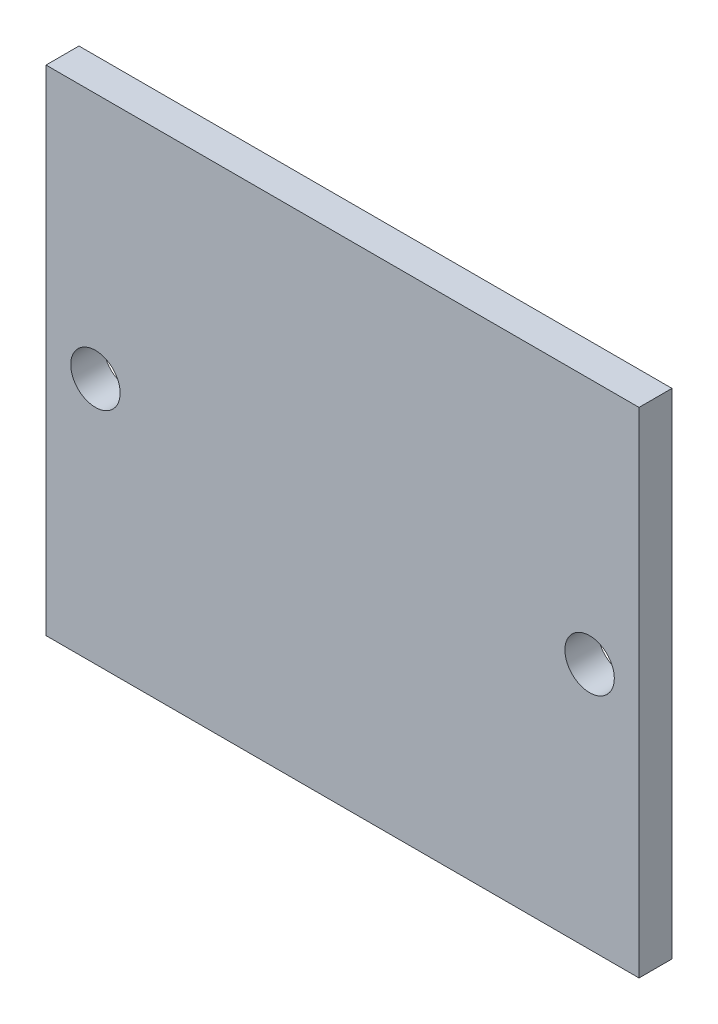
ISO-10303-21;
HEADER;
FILE_DESCRIPTION(('STEP AP214'),'2;1');
FILE_NAME('part.step','',(''),(''),'','','');
FILE_SCHEMA(('AUTOMOTIVE_DESIGN { 1 0 10303 214 1 1 1 1 }'));
ENDSEC;
DATA;
#1=APPLICATION_CONTEXT('core data for automotive mechanical design processes');
#2=APPLICATION_PROTOCOL_DEFINITION('international standard','automotive_design',2000,#1);
#3=PRODUCT_CONTEXT('',#1,'mechanical');
#4=PRODUCT('Part','Part','',(#3));
#5=PRODUCT_RELATED_PRODUCT_CATEGORY('part','',(#4));
#6=PRODUCT_DEFINITION_FORMATION('','',#4);
#7=PRODUCT_DEFINITION_CONTEXT('part definition',#1,'design');
#8=PRODUCT_DEFINITION('design','',#6,#7);
#9=PRODUCT_DEFINITION_SHAPE('','',#8);
#10=(LENGTH_UNIT() NAMED_UNIT(*) SI_UNIT(.MILLI.,.METRE.));
#11=(NAMED_UNIT(*) PLANE_ANGLE_UNIT() SI_UNIT($,.RADIAN.));
#12=(NAMED_UNIT(*) SI_UNIT($,.STERADIAN.) SOLID_ANGLE_UNIT());
#13=UNCERTAINTY_MEASURE_WITH_UNIT(LENGTH_MEASURE(1.E-05),#10,'distance_accuracy_value','');
#14=(GEOMETRIC_REPRESENTATION_CONTEXT(3) GLOBAL_UNCERTAINTY_ASSIGNED_CONTEXT((#13)) GLOBAL_UNIT_ASSIGNED_CONTEXT((#10,
#11,#12)) REPRESENTATION_CONTEXT('',''));
#15=CARTESIAN_POINT('',(0.,0.,0.));
#16=DIRECTION('',(0.,0.,1.));
#17=DIRECTION('',(1.,0.,0.));
#18=AXIS2_PLACEMENT_3D('',#15,#16,#17);
#19=CARTESIAN_POINT('',(0.,0.,2.));
#20=DIRECTION('',(0.,0.,-1.));
#21=DIRECTION('',(-1.,0.,0.));
#22=AXIS2_PLACEMENT_3D('',#19,#20,#21);
#23=PLANE('',#22);
#24=DIRECTION('',(0.,1.,0.));
#25=VECTOR('',#24,1.);
#26=CARTESIAN_POINT('',(18.,-15.,2.));
#27=LINE('',#26,#25);
#28=CARTESIAN_POINT('',(18.,-15.,2.));
#29=VERTEX_POINT('',#28);
#30=CARTESIAN_POINT('',(18.,15.,2.));
#31=VERTEX_POINT('',#30);
#32=EDGE_CURVE('E85',#29,#31,#27,.T.);
#33=ORIENTED_EDGE('',*,*,#32,.T.);
#34=DIRECTION('',(-1.,0.,0.));
#35=VECTOR('',#34,1.);
#36=CARTESIAN_POINT('',(-18.,15.,2.));
#37=LINE('',#36,#35);
#38=CARTESIAN_POINT('',(-18.,15.,2.));
#39=VERTEX_POINT('',#38);
#40=EDGE_CURVE('E80',#31,#39,#37,.T.);
#41=ORIENTED_EDGE('',*,*,#40,.T.);
#42=DIRECTION('',(0.,-1.,0.));
#43=VECTOR('',#42,1.);
#44=CARTESIAN_POINT('',(-18.,-15.,2.));
#45=LINE('',#44,#43);
#46=CARTESIAN_POINT('',(-18.,-15.,2.));
#47=VERTEX_POINT('',#46);
#48=EDGE_CURVE('E83',#39,#47,#45,.T.);
#49=ORIENTED_EDGE('',*,*,#48,.T.);
#50=DIRECTION('',(1.,0.,0.));
#51=VECTOR('',#50,1.);
#52=CARTESIAN_POINT('',(-18.,-15.,2.));
#53=LINE('',#52,#51);
#54=EDGE_CURVE('E50',#47,#29,#53,.T.);
#55=ORIENTED_EDGE('',*,*,#54,.T.);
#56=EDGE_LOOP('',(#33,#41,#49,#55));
#57=FACE_BOUND('',#56,.T.);
#58=CARTESIAN_POINT('',(-15.,0.,2.));
#59=DIRECTION('',(0.,0.,1.));
#60=DIRECTION('',(1.,0.,0.));
#61=AXIS2_PLACEMENT_3D('',#58,#59,#60);
#62=CIRCLE('',#61,1.5);
#63=CARTESIAN_POINT('',(-13.5,0.,2.));
#64=VERTEX_POINT('',#63);
#65=EDGE_CURVE('E100',#64,#64,#62,.T.);
#66=ORIENTED_EDGE('',*,*,#65,.F.);
#67=EDGE_LOOP('',(#66));
#68=FACE_BOUND('',#67,.T.);
#69=CARTESIAN_POINT('',(15.,0.,2.));
#70=DIRECTION('',(0.,0.,1.));
#71=DIRECTION('',(1.,0.,0.));
#72=AXIS2_PLACEMENT_3D('',#69,#70,#71);
#73=CIRCLE('',#72,1.5);
#74=CARTESIAN_POINT('',(16.5,0.,2.));
#75=VERTEX_POINT('',#74);
#76=EDGE_CURVE('E115',#75,#75,#73,.T.);
#77=ORIENTED_EDGE('',*,*,#76,.F.);
#78=EDGE_LOOP('',(#77));
#79=FACE_BOUND('',#78,.T.);
#80=ADVANCED_FACE('F33',(#57,#68,#79),#23,.F.);
#81=CARTESIAN_POINT('',(0.,0.,0.));
#82=DIRECTION('',(0.,0.,-1.));
#83=DIRECTION('',(-1.,0.,0.));
#84=AXIS2_PLACEMENT_3D('',#81,#82,#83);
#85=PLANE('',#84);
#86=CARTESIAN_POINT('',(-15.,0.,0.));
#87=DIRECTION('',(0.,0.,1.));
#88=DIRECTION('',(1.,0.,0.));
#89=AXIS2_PLACEMENT_3D('',#86,#87,#88);
#90=CIRCLE('',#89,1.5);
#91=CARTESIAN_POINT('',(-13.5,0.,0.));
#92=VERTEX_POINT('',#91);
#93=EDGE_CURVE('E112',#92,#92,#90,.T.);
#94=ORIENTED_EDGE('',*,*,#93,.T.);
#95=EDGE_LOOP('',(#94));
#96=FACE_BOUND('',#95,.T.);
#97=DIRECTION('',(0.,1.,0.));
#98=VECTOR('',#97,1.);
#99=CARTESIAN_POINT('',(18.,-15.,0.));
#100=LINE('',#99,#98);
#101=CARTESIAN_POINT('',(18.,-15.,0.));
#102=VERTEX_POINT('',#101);
#103=CARTESIAN_POINT('',(18.,15.,0.));
#104=VERTEX_POINT('',#103);
#105=EDGE_CURVE('E97',#102,#104,#100,.T.);
#106=ORIENTED_EDGE('',*,*,#105,.F.);
#107=DIRECTION('',(1.,0.,0.));
#108=VECTOR('',#107,1.);
#109=CARTESIAN_POINT('',(-18.,-15.,0.));
#110=LINE('',#109,#108);
#111=CARTESIAN_POINT('',(-18.,-15.,0.));
#112=VERTEX_POINT('',#111);
#113=EDGE_CURVE('E73',#112,#102,#110,.T.);
#114=ORIENTED_EDGE('',*,*,#113,.F.);
#115=DIRECTION('',(0.,-1.,0.));
#116=VECTOR('',#115,1.);
#117=CARTESIAN_POINT('',(-18.,-15.,0.));
#118=LINE('',#117,#116);
#119=CARTESIAN_POINT('',(-18.,15.,0.));
#120=VERTEX_POINT('',#119);
#121=EDGE_CURVE('E67',#120,#112,#118,.T.);
#122=ORIENTED_EDGE('',*,*,#121,.F.);
#123=DIRECTION('',(-1.,0.,0.));
#124=VECTOR('',#123,1.);
#125=CARTESIAN_POINT('',(-18.,15.,0.));
#126=LINE('',#125,#124);
#127=EDGE_CURVE('E89',#104,#120,#126,.T.);
#128=ORIENTED_EDGE('',*,*,#127,.F.);
#129=EDGE_LOOP('',(#106,#114,#122,#128));
#130=FACE_BOUND('',#129,.T.);
#131=CARTESIAN_POINT('',(15.,0.,0.));
#132=DIRECTION('',(0.,0.,1.));
#133=DIRECTION('',(1.,0.,0.));
#134=AXIS2_PLACEMENT_3D('',#131,#132,#133);
#135=CIRCLE('',#134,1.5);
#136=CARTESIAN_POINT('',(16.5,0.,0.));
#137=VERTEX_POINT('',#136);
#138=EDGE_CURVE('E118',#137,#137,#135,.T.);
#139=ORIENTED_EDGE('',*,*,#138,.T.);
#140=EDGE_LOOP('',(#139));
#141=FACE_BOUND('',#140,.T.);
#142=ADVANCED_FACE('F108',(#96,#130,#141),#85,.T.);
#143=CARTESIAN_POINT('',(18.,-15.,2.));
#144=DIRECTION('',(-1.,0.,0.));
#145=DIRECTION('',(0.,0.,1.));
#146=AXIS2_PLACEMENT_3D('',#143,#144,#145);
#147=PLANE('',#146);
#148=ORIENTED_EDGE('',*,*,#105,.T.);
#149=DIRECTION('',(0.,0.,-1.));
#150=VECTOR('',#149,1.);
#151=CARTESIAN_POINT('',(18.,15.,2.));
#152=LINE('',#151,#150);
#153=EDGE_CURVE('E11',#31,#104,#152,.T.);
#154=ORIENTED_EDGE('',*,*,#153,.F.);
#155=ORIENTED_EDGE('',*,*,#32,.F.);
#156=DIRECTION('',(0.,0.,-1.));
#157=VECTOR('',#156,1.);
#158=CARTESIAN_POINT('',(18.,-15.,2.));
#159=LINE('',#158,#157);
#160=EDGE_CURVE('E93',#29,#102,#159,.T.);
#161=ORIENTED_EDGE('',*,*,#160,.T.);
#162=EDGE_LOOP('',(#148,#154,#155,#161));
#163=FACE_BOUND('',#162,.T.);
#164=ADVANCED_FACE('F35',(#163),#147,.F.);
#165=CARTESIAN_POINT('',(-18.,15.,2.));
#166=DIRECTION('',(0.,-1.,0.));
#167=DIRECTION('',(0.,0.,-1.));
#168=AXIS2_PLACEMENT_3D('',#165,#166,#167);
#169=PLANE('',#168);
#170=ORIENTED_EDGE('',*,*,#127,.T.);
#171=DIRECTION('',(0.,0.,-1.));
#172=VECTOR('',#171,1.);
#173=CARTESIAN_POINT('',(-18.,15.,2.));
#174=LINE('',#173,#172);
#175=EDGE_CURVE('E42',#39,#120,#174,.T.);
#176=ORIENTED_EDGE('',*,*,#175,.F.);
#177=ORIENTED_EDGE('',*,*,#40,.F.);
#178=ORIENTED_EDGE('',*,*,#153,.T.);
#179=EDGE_LOOP('',(#170,#176,#177,#178));
#180=FACE_BOUND('',#179,.T.);
#181=ADVANCED_FACE('F88',(#180),#169,.F.);
#182=CARTESIAN_POINT('',(-18.,-15.,2.));
#183=DIRECTION('',(1.,0.,0.));
#184=DIRECTION('',(0.,0.,-1.));
#185=AXIS2_PLACEMENT_3D('',#182,#183,#184);
#186=PLANE('',#185);
#187=ORIENTED_EDGE('',*,*,#121,.T.);
#188=DIRECTION('',(0.,0.,-1.));
#189=VECTOR('',#188,1.);
#190=CARTESIAN_POINT('',(-18.,-15.,2.));
#191=LINE('',#190,#189);
#192=EDGE_CURVE('E90',#47,#112,#191,.T.);
#193=ORIENTED_EDGE('',*,*,#192,.F.);
#194=ORIENTED_EDGE('',*,*,#48,.F.);
#195=ORIENTED_EDGE('',*,*,#175,.T.);
#196=EDGE_LOOP('',(#187,#193,#194,#195));
#197=FACE_BOUND('',#196,.T.);
#198=ADVANCED_FACE('F91',(#197),#186,.F.);
#199=CARTESIAN_POINT('',(-18.,-15.,2.));
#200=DIRECTION('',(0.,1.,0.));
#201=DIRECTION('',(0.,0.,1.));
#202=AXIS2_PLACEMENT_3D('',#199,#200,#201);
#203=PLANE('',#202);
#204=ORIENTED_EDGE('',*,*,#113,.T.);
#205=ORIENTED_EDGE('',*,*,#160,.F.);
#206=ORIENTED_EDGE('',*,*,#54,.F.);
#207=ORIENTED_EDGE('',*,*,#192,.T.);
#208=EDGE_LOOP('',(#204,#205,#206,#207));
#209=FACE_BOUND('',#208,.T.);
#210=ADVANCED_FACE('F105',(#209),#203,.F.);
#211=CARTESIAN_POINT('',(-15.,0.,2.));
#212=DIRECTION('',(0.,0.,-1.));
#213=DIRECTION('',(-1.,0.,0.));
#214=AXIS2_PLACEMENT_3D('',#211,#212,#213);
#215=CYLINDRICAL_SURFACE('',#214,1.5);
#216=ORIENTED_EDGE('',*,*,#65,.T.);
#217=EDGE_LOOP('',(#216));
#218=FACE_BOUND('',#217,.T.);
#219=ORIENTED_EDGE('',*,*,#93,.F.);
#220=EDGE_LOOP('',(#219));
#221=FACE_BOUND('',#220,.T.);
#222=ADVANCED_FACE('F135',(#218,#221),#215,.F.);
#223=CARTESIAN_POINT('',(15.,0.,2.));
#224=DIRECTION('',(0.,0.,-1.));
#225=DIRECTION('',(-1.,0.,0.));
#226=AXIS2_PLACEMENT_3D('',#223,#224,#225);
#227=CYLINDRICAL_SURFACE('',#226,1.5);
#228=ORIENTED_EDGE('',*,*,#76,.T.);
#229=EDGE_LOOP('',(#228));
#230=FACE_BOUND('',#229,.T.);
#231=ORIENTED_EDGE('',*,*,#138,.F.);
#232=EDGE_LOOP('',(#231));
#233=FACE_BOUND('',#232,.T.);
#234=ADVANCED_FACE('F124',(#230,#233),#227,.F.);
#235=CLOSED_SHELL('',(#80,#142,#164,#181,#198,#210,#222,#234));
#236=MANIFOLD_SOLID_BREP('B2',#235);
#237=ADVANCED_BREP_SHAPE_REPRESENTATION('',(#18,#236),#14);
#238=SHAPE_DEFINITION_REPRESENTATION(#9,#237);
ENDSEC;
END-ISO-10303-21;
